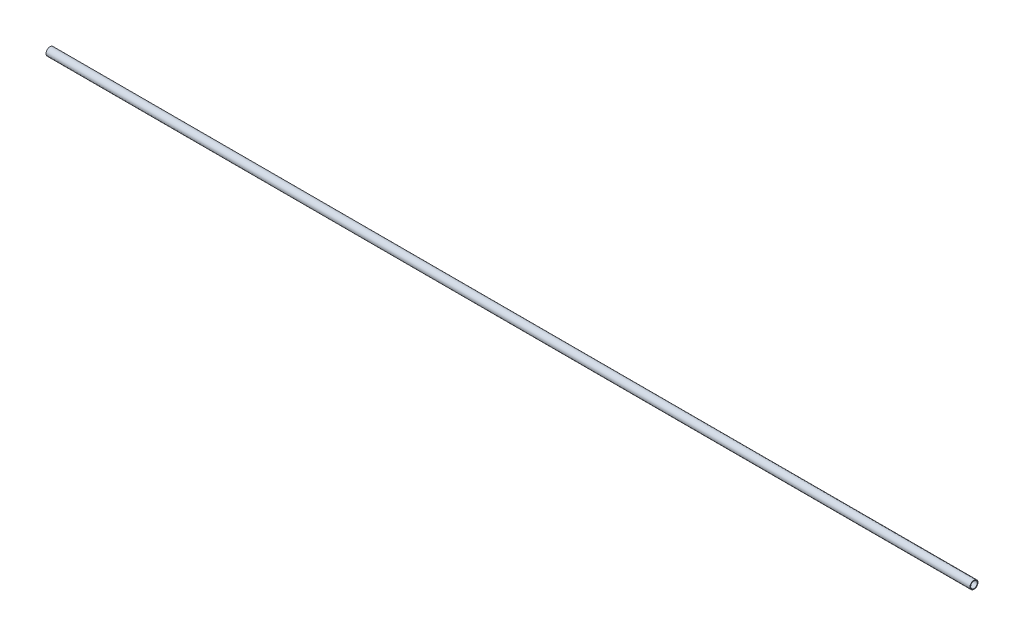
ISO-10303-21;
HEADER;
FILE_DESCRIPTION(('STEP AP214'),'2;1');
FILE_NAME('part.step','',(''),(''),'','','');
FILE_SCHEMA(('AUTOMOTIVE_DESIGN { 1 0 10303 214 1 1 1 1 }'));
ENDSEC;
DATA;
#1=APPLICATION_CONTEXT('core data for automotive mechanical design processes');
#2=APPLICATION_PROTOCOL_DEFINITION('international standard','automotive_design',2000,#1);
#3=PRODUCT_CONTEXT('',#1,'mechanical');
#4=PRODUCT('Part','Part','',(#3));
#5=PRODUCT_RELATED_PRODUCT_CATEGORY('part','',(#4));
#6=PRODUCT_DEFINITION_FORMATION('','',#4);
#7=PRODUCT_DEFINITION_CONTEXT('part definition',#1,'design');
#8=PRODUCT_DEFINITION('design','',#6,#7);
#9=PRODUCT_DEFINITION_SHAPE('','',#8);
#10=(LENGTH_UNIT() NAMED_UNIT(*) SI_UNIT(.MILLI.,.METRE.));
#11=(NAMED_UNIT(*) PLANE_ANGLE_UNIT() SI_UNIT($,.RADIAN.));
#12=(NAMED_UNIT(*) SI_UNIT($,.STERADIAN.) SOLID_ANGLE_UNIT());
#13=UNCERTAINTY_MEASURE_WITH_UNIT(LENGTH_MEASURE(1.E-05),#10,'distance_accuracy_value','');
#14=(GEOMETRIC_REPRESENTATION_CONTEXT(3) GLOBAL_UNCERTAINTY_ASSIGNED_CONTEXT((#13)) GLOBAL_UNIT_ASSIGNED_CONTEXT((#10,
#11,#12)) REPRESENTATION_CONTEXT('',''));
#15=CARTESIAN_POINT('',(0.,0.,0.));
#16=DIRECTION('',(0.,0.,1.));
#17=DIRECTION('',(1.,0.,0.));
#18=AXIS2_PLACEMENT_3D('',#15,#16,#17);
#19=CARTESIAN_POINT('',(457.2,0.,0.));
#20=DIRECTION('',(1.,0.,0.));
#21=DIRECTION('',(0.,0.,-1.));
#22=AXIS2_PLACEMENT_3D('',#19,#20,#21);
#23=PLANE('',#22);
#24=CARTESIAN_POINT('',(457.2,0.,0.));
#25=DIRECTION('',(1.,0.,0.));
#26=DIRECTION('',(0.,0.,-1.));
#27=AXIS2_PLACEMENT_3D('',#24,#25,#26);
#28=CIRCLE('',#27,3.96875);
#29=CARTESIAN_POINT('',(457.2,0.,-3.96875));
#30=VERTEX_POINT('',#29);
#31=EDGE_CURVE('E10',#30,#30,#28,.T.);
#32=ORIENTED_EDGE('',*,*,#31,.T.);
#33=EDGE_LOOP('',(#32));
#34=FACE_BOUND('',#33,.T.);
#35=CARTESIAN_POINT('',(457.2,0.,0.));
#36=DIRECTION('',(1.,0.,0.));
#37=DIRECTION('',(0.,0.,-1.));
#38=AXIS2_PLACEMENT_3D('',#35,#36,#37);
#39=CIRCLE('',#38,3.2639);
#40=CARTESIAN_POINT('',(457.2,0.,-3.2639));
#41=VERTEX_POINT('',#40);
#42=EDGE_CURVE('E41',#41,#41,#39,.T.);
#43=ORIENTED_EDGE('',*,*,#42,.F.);
#44=EDGE_LOOP('',(#43));
#45=FACE_BOUND('',#44,.T.);
#46=ADVANCED_FACE('F30',(#34,#45),#23,.T.);
#47=CARTESIAN_POINT('',(-457.2,0.,0.));
#48=DIRECTION('',(1.,0.,0.));
#49=DIRECTION('',(0.,0.,-1.));
#50=AXIS2_PLACEMENT_3D('',#47,#48,#49);
#51=PLANE('',#50);
#52=CARTESIAN_POINT('',(-457.2,0.,0.));
#53=DIRECTION('',(1.,0.,0.));
#54=DIRECTION('',(0.,0.,-1.));
#55=AXIS2_PLACEMENT_3D('',#52,#53,#54);
#56=CIRCLE('',#55,3.96875);
#57=CARTESIAN_POINT('',(-457.2,0.,-3.96875));
#58=VERTEX_POINT('',#57);
#59=EDGE_CURVE('E34',#58,#58,#56,.T.);
#60=ORIENTED_EDGE('',*,*,#59,.F.);
#61=EDGE_LOOP('',(#60));
#62=FACE_BOUND('',#61,.T.);
#63=CARTESIAN_POINT('',(-457.2,0.,0.));
#64=DIRECTION('',(1.,0.,0.));
#65=DIRECTION('',(0.,0.,-1.));
#66=AXIS2_PLACEMENT_3D('',#63,#64,#65);
#67=CIRCLE('',#66,3.2639);
#68=CARTESIAN_POINT('',(-457.2,0.,-3.2639));
#69=VERTEX_POINT('',#68);
#70=EDGE_CURVE('E43',#69,#69,#67,.T.);
#71=ORIENTED_EDGE('',*,*,#70,.T.);
#72=EDGE_LOOP('',(#71));
#73=FACE_BOUND('',#72,.T.);
#74=ADVANCED_FACE('F53',(#62,#73),#51,.F.);
#75=CARTESIAN_POINT('',(457.2,0.,0.));
#76=DIRECTION('',(-1.,0.,0.));
#77=DIRECTION('',(0.,0.,1.));
#78=AXIS2_PLACEMENT_3D('',#75,#76,#77);
#79=CYLINDRICAL_SURFACE('',#78,3.96875);
#80=ORIENTED_EDGE('',*,*,#31,.F.);
#81=EDGE_LOOP('',(#80));
#82=FACE_BOUND('',#81,.T.);
#83=ORIENTED_EDGE('',*,*,#59,.T.);
#84=EDGE_LOOP('',(#83));
#85=FACE_BOUND('',#84,.T.);
#86=ADVANCED_FACE('F32',(#82,#85),#79,.T.);
#87=CARTESIAN_POINT('',(457.2,0.,0.));
#88=DIRECTION('',(-1.,0.,0.));
#89=DIRECTION('',(0.,0.,1.));
#90=AXIS2_PLACEMENT_3D('',#87,#88,#89);
#91=CYLINDRICAL_SURFACE('',#90,3.2639);
#92=ORIENTED_EDGE('',*,*,#42,.T.);
#93=EDGE_LOOP('',(#92));
#94=FACE_BOUND('',#93,.T.);
#95=ORIENTED_EDGE('',*,*,#70,.F.);
#96=EDGE_LOOP('',(#95));
#97=FACE_BOUND('',#96,.T.);
#98=ADVANCED_FACE('F49',(#94,#97),#91,.F.);
#99=CLOSED_SHELL('',(#46,#74,#86,#98));
#100=MANIFOLD_SOLID_BREP('B2',#99);
#101=ADVANCED_BREP_SHAPE_REPRESENTATION('',(#18,#100),#14);
#102=SHAPE_DEFINITION_REPRESENTATION(#9,#101);
ENDSEC;
END-ISO-10303-21;
